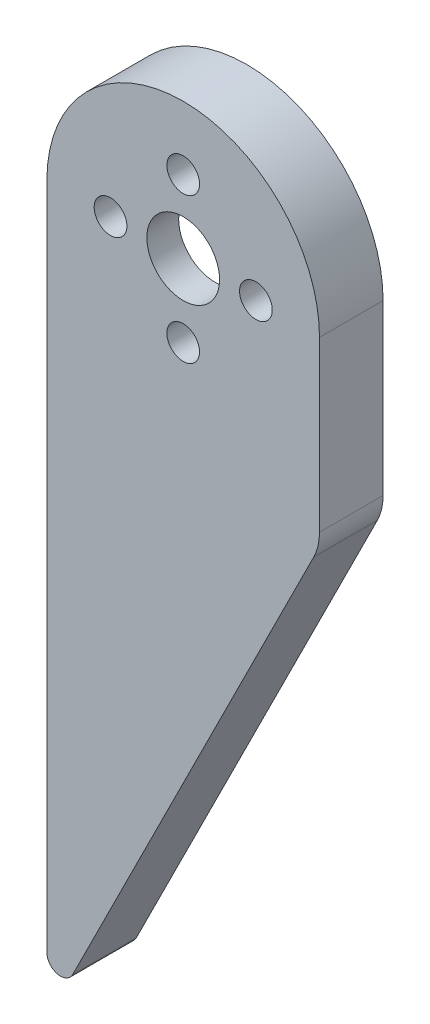
ISO-10303-21;
HEADER;
FILE_DESCRIPTION(('STEP AP214'),'2;1');
FILE_NAME('part.step','',(''),(''),'','','');
FILE_SCHEMA(('AUTOMOTIVE_DESIGN { 1 0 10303 214 1 1 1 1 }'));
ENDSEC;
DATA;
#1=APPLICATION_CONTEXT('core data for automotive mechanical design processes');
#2=APPLICATION_PROTOCOL_DEFINITION('international standard','automotive_design',2000,#1);
#3=PRODUCT_CONTEXT('',#1,'mechanical');
#4=PRODUCT('Part','Part','',(#3));
#5=PRODUCT_RELATED_PRODUCT_CATEGORY('part','',(#4));
#6=PRODUCT_DEFINITION_FORMATION('','',#4);
#7=PRODUCT_DEFINITION_CONTEXT('part definition',#1,'design');
#8=PRODUCT_DEFINITION('design','',#6,#7);
#9=PRODUCT_DEFINITION_SHAPE('','',#8);
#10=(LENGTH_UNIT() NAMED_UNIT(*) SI_UNIT(.MILLI.,.METRE.));
#11=(NAMED_UNIT(*) PLANE_ANGLE_UNIT() SI_UNIT($,.RADIAN.));
#12=(NAMED_UNIT(*) SI_UNIT($,.STERADIAN.) SOLID_ANGLE_UNIT());
#13=UNCERTAINTY_MEASURE_WITH_UNIT(LENGTH_MEASURE(1.E-05),#10,'distance_accuracy_value','');
#14=(GEOMETRIC_REPRESENTATION_CONTEXT(3) GLOBAL_UNCERTAINTY_ASSIGNED_CONTEXT((#13)) GLOBAL_UNIT_ASSIGNED_CONTEXT((#10,
#11,#12)) REPRESENTATION_CONTEXT('',''));
#15=CARTESIAN_POINT('',(0.,0.,0.));
#16=DIRECTION('',(0.,0.,1.));
#17=DIRECTION('',(1.,0.,0.));
#18=AXIS2_PLACEMENT_3D('',#15,#16,#17);
#19=CARTESIAN_POINT('',(0.,8.,7.));
#20=DIRECTION('',(0.,0.,-1.));
#21=DIRECTION('',(-1.,0.,0.));
#22=AXIS2_PLACEMENT_3D('',#19,#20,#21);
#23=CYLINDRICAL_SURFACE('',#22,1.8);
#24=CARTESIAN_POINT('',(0.,8.,7.));
#25=DIRECTION('',(0.,0.,1.));
#26=DIRECTION('',(1.,0.,0.));
#27=AXIS2_PLACEMENT_3D('',#24,#25,#26);
#28=CIRCLE('',#27,1.8);
#29=CARTESIAN_POINT('',(1.8,8.,7.));
#30=VERTEX_POINT('',#29);
#31=EDGE_CURVE('E134',#30,#30,#28,.T.);
#32=ORIENTED_EDGE('',*,*,#31,.T.);
#33=EDGE_LOOP('',(#32));
#34=FACE_BOUND('',#33,.T.);
#35=CARTESIAN_POINT('',(0.,8.,3.5));
#36=DIRECTION('',(0.,0.,-1.));
#37=DIRECTION('',(-1.,0.,0.));
#38=AXIS2_PLACEMENT_3D('',#35,#36,#37);
#39=CIRCLE('',#38,1.8);
#40=CARTESIAN_POINT('',(-1.8,8.,3.5));
#41=VERTEX_POINT('',#40);
#42=EDGE_CURVE('E119',#41,#41,#39,.T.);
#43=ORIENTED_EDGE('',*,*,#42,.T.);
#44=EDGE_LOOP('',(#43));
#45=FACE_BOUND('',#44,.T.);
#46=ADVANCED_FACE('F37',(#34,#45),#23,.F.);
#47=CARTESIAN_POINT('',(8.,0.,7.));
#48=DIRECTION('',(0.,0.,-1.));
#49=DIRECTION('',(-1.,0.,0.));
#50=AXIS2_PLACEMENT_3D('',#47,#48,#49);
#51=CYLINDRICAL_SURFACE('',#50,1.8);
#52=CARTESIAN_POINT('',(8.,0.,7.));
#53=DIRECTION('',(0.,0.,1.));
#54=DIRECTION('',(1.,0.,0.));
#55=AXIS2_PLACEMENT_3D('',#52,#53,#54);
#56=CIRCLE('',#55,1.8);
#57=CARTESIAN_POINT('',(9.8,0.,7.));
#58=VERTEX_POINT('',#57);
#59=EDGE_CURVE('E131',#58,#58,#56,.T.);
#60=ORIENTED_EDGE('',*,*,#59,.T.);
#61=EDGE_LOOP('',(#60));
#62=FACE_BOUND('',#61,.T.);
#63=CARTESIAN_POINT('',(8.,0.,3.5));
#64=DIRECTION('',(0.,0.,-1.));
#65=DIRECTION('',(-1.,0.,0.));
#66=AXIS2_PLACEMENT_3D('',#63,#64,#65);
#67=CIRCLE('',#66,1.8);
#68=CARTESIAN_POINT('',(6.2,0.,3.5));
#69=VERTEX_POINT('',#68);
#70=EDGE_CURVE('E233',#69,#69,#67,.T.);
#71=ORIENTED_EDGE('',*,*,#70,.T.);
#72=EDGE_LOOP('',(#71));
#73=FACE_BOUND('',#72,.T.);
#74=ADVANCED_FACE('F180',(#62,#73),#51,.F.);
#75=CARTESIAN_POINT('',(0.,-8.,7.));
#76=DIRECTION('',(0.,0.,-1.));
#77=DIRECTION('',(-1.,0.,0.));
#78=AXIS2_PLACEMENT_3D('',#75,#76,#77);
#79=CYLINDRICAL_SURFACE('',#78,1.8);
#80=CARTESIAN_POINT('',(0.,-8.,7.));
#81=DIRECTION('',(0.,0.,1.));
#82=DIRECTION('',(1.,0.,0.));
#83=AXIS2_PLACEMENT_3D('',#80,#81,#82);
#84=CIRCLE('',#83,1.8);
#85=CARTESIAN_POINT('',(1.8,-8.,7.));
#86=VERTEX_POINT('',#85);
#87=EDGE_CURVE('E128',#86,#86,#84,.T.);
#88=ORIENTED_EDGE('',*,*,#87,.T.);
#89=EDGE_LOOP('',(#88));
#90=FACE_BOUND('',#89,.T.);
#91=CARTESIAN_POINT('',(0.,-8.,3.5));
#92=DIRECTION('',(0.,0.,-1.));
#93=DIRECTION('',(-1.,0.,0.));
#94=AXIS2_PLACEMENT_3D('',#91,#92,#93);
#95=CIRCLE('',#94,1.8);
#96=CARTESIAN_POINT('',(-1.8,-8.,3.5));
#97=VERTEX_POINT('',#96);
#98=EDGE_CURVE('E222',#97,#97,#95,.T.);
#99=ORIENTED_EDGE('',*,*,#98,.T.);
#100=EDGE_LOOP('',(#99));
#101=FACE_BOUND('',#100,.T.);
#102=ADVANCED_FACE('F186',(#90,#101),#79,.F.);
#103=CARTESIAN_POINT('',(-8.,0.,7.));
#104=DIRECTION('',(0.,0.,-1.));
#105=DIRECTION('',(-1.,0.,0.));
#106=AXIS2_PLACEMENT_3D('',#103,#104,#105);
#107=CYLINDRICAL_SURFACE('',#106,1.8);
#108=CARTESIAN_POINT('',(-8.,0.,7.));
#109=DIRECTION('',(0.,0.,1.));
#110=DIRECTION('',(1.,0.,0.));
#111=AXIS2_PLACEMENT_3D('',#108,#109,#110);
#112=CIRCLE('',#111,1.8);
#113=CARTESIAN_POINT('',(-6.2,0.,7.));
#114=VERTEX_POINT('',#113);
#115=EDGE_CURVE('E125',#114,#114,#112,.T.);
#116=ORIENTED_EDGE('',*,*,#115,.T.);
#117=EDGE_LOOP('',(#116));
#118=FACE_BOUND('',#117,.T.);
#119=CARTESIAN_POINT('',(-8.,0.,3.5));
#120=DIRECTION('',(0.,0.,-1.));
#121=DIRECTION('',(-1.,0.,0.));
#122=AXIS2_PLACEMENT_3D('',#119,#120,#121);
#123=CIRCLE('',#122,1.8);
#124=CARTESIAN_POINT('',(-9.8,0.,3.5));
#125=VERTEX_POINT('',#124);
#126=EDGE_CURVE('E219',#125,#125,#123,.T.);
#127=ORIENTED_EDGE('',*,*,#126,.T.);
#128=EDGE_LOOP('',(#127));
#129=FACE_BOUND('',#128,.T.);
#130=ADVANCED_FACE('F196',(#118,#129),#107,.F.);
#131=CARTESIAN_POINT('',(0.,0.,7.));
#132=DIRECTION('',(0.,0.,-1.));
#133=DIRECTION('',(-1.,0.,0.));
#134=AXIS2_PLACEMENT_3D('',#131,#132,#133);
#135=CYLINDRICAL_SURFACE('',#134,4.);
#136=CARTESIAN_POINT('',(0.,0.,7.));
#137=DIRECTION('',(0.,0.,1.));
#138=DIRECTION('',(1.,0.,0.));
#139=AXIS2_PLACEMENT_3D('',#136,#137,#138);
#140=CIRCLE('',#139,4.);
#141=CARTESIAN_POINT('',(4.,0.,7.));
#142=VERTEX_POINT('',#141);
#143=EDGE_CURVE('E137',#142,#142,#140,.T.);
#144=ORIENTED_EDGE('',*,*,#143,.T.);
#145=EDGE_LOOP('',(#144));
#146=FACE_BOUND('',#145,.T.);
#147=CARTESIAN_POINT('',(0.,0.,3.5));
#148=DIRECTION('',(0.,0.,-1.));
#149=DIRECTION('',(-1.,0.,0.));
#150=AXIS2_PLACEMENT_3D('',#147,#148,#149);
#151=CIRCLE('',#150,4.);
#152=CARTESIAN_POINT('',(-4.,0.,3.5));
#153=VERTEX_POINT('',#152);
#154=EDGE_CURVE('E41',#153,#153,#151,.T.);
#155=ORIENTED_EDGE('',*,*,#154,.T.);
#156=EDGE_LOOP('',(#155));
#157=FACE_BOUND('',#156,.T.);
#158=ADVANCED_FACE('F191',(#146,#157),#135,.F.);
#159=CARTESIAN_POINT('',(15.,0.,7.));
#160=DIRECTION('',(1.,0.,0.));
#161=DIRECTION('',(0.,1.,0.));
#162=AXIS2_PLACEMENT_3D('',#159,#160,#161);
#163=PLANE('',#162);
#164=DIRECTION('',(0.,-1.,0.));
#165=VECTOR('',#164,1.);
#166=CARTESIAN_POINT('',(15.,0.,7.));
#167=LINE('',#166,#165);
#168=CARTESIAN_POINT('',(15.,0.,7.));
#169=VERTEX_POINT('',#168);
#170=CARTESIAN_POINT('',(15.,-18.5835921350013,7.));
#171=VERTEX_POINT('',#170);
#172=EDGE_CURVE('E94',#169,#171,#167,.T.);
#173=ORIENTED_EDGE('',*,*,#172,.T.);
#174=DIRECTION('',(0.,0.,-1.));
#175=VECTOR('',#174,1.);
#176=CARTESIAN_POINT('',(15.,-18.5835921350013,7.));
#177=LINE('',#176,#175);
#178=CARTESIAN_POINT('',(15.,-18.5835921350013,0.));
#179=VERTEX_POINT('',#178);
#180=EDGE_CURVE('E155',#171,#179,#177,.T.);
#181=ORIENTED_EDGE('',*,*,#180,.T.);
#182=DIRECTION('',(0.,-1.,0.));
#183=VECTOR('',#182,1.);
#184=CARTESIAN_POINT('',(15.,0.,0.));
#185=LINE('',#184,#183);
#186=CARTESIAN_POINT('',(15.,0.,0.));
#187=VERTEX_POINT('',#186);
#188=EDGE_CURVE('E96',#187,#179,#185,.T.);
#189=ORIENTED_EDGE('',*,*,#188,.F.);
#190=DIRECTION('',(0.,0.,-1.));
#191=VECTOR('',#190,1.);
#192=CARTESIAN_POINT('',(15.,0.,7.));
#193=LINE('',#192,#191);
#194=EDGE_CURVE('E89',#169,#187,#193,.T.);
#195=ORIENTED_EDGE('',*,*,#194,.F.);
#196=EDGE_LOOP('',(#173,#181,#189,#195));
#197=FACE_BOUND('',#196,.T.);
#198=ADVANCED_FACE('F91',(#197),#163,.T.);
#199=CARTESIAN_POINT('',(0.,0.,7.));
#200=DIRECTION('',(0.,0.,-1.));
#201=DIRECTION('',(-1.,0.,0.));
#202=AXIS2_PLACEMENT_3D('',#199,#200,#201);
#203=CYLINDRICAL_SURFACE('',#202,15.);
#204=CARTESIAN_POINT('',(0.,0.,0.));
#205=DIRECTION('',(0.,0.,1.));
#206=DIRECTION('',(1.,0.,0.));
#207=AXIS2_PLACEMENT_3D('',#204,#205,#206);
#208=CIRCLE('',#207,15.);
#209=CARTESIAN_POINT('',(-15.,0.,0.));
#210=VERTEX_POINT('',#209);
#211=EDGE_CURVE('E141',#187,#210,#208,.T.);
#212=ORIENTED_EDGE('',*,*,#211,.T.);
#213=DIRECTION('',(0.,0.,-1.));
#214=VECTOR('',#213,1.);
#215=CARTESIAN_POINT('',(-15.,0.,7.));
#216=LINE('',#215,#214);
#217=CARTESIAN_POINT('',(-15.,0.,7.));
#218=VERTEX_POINT('',#217);
#219=EDGE_CURVE('E100',#218,#210,#216,.T.);
#220=ORIENTED_EDGE('',*,*,#219,.F.);
#221=CARTESIAN_POINT('',(0.,0.,7.));
#222=DIRECTION('',(0.,0.,1.));
#223=DIRECTION('',(1.,0.,0.));
#224=AXIS2_PLACEMENT_3D('',#221,#222,#223);
#225=CIRCLE('',#224,15.);
#226=EDGE_CURVE('E103',#169,#218,#225,.T.);
#227=ORIENTED_EDGE('',*,*,#226,.F.);
#228=ORIENTED_EDGE('',*,*,#194,.T.);
#229=EDGE_LOOP('',(#212,#220,#227,#228));
#230=FACE_BOUND('',#229,.T.);
#231=ADVANCED_FACE('F104',(#230),#203,.T.);
#232=CARTESIAN_POINT('',(-15.,0.,7.));
#233=DIRECTION('',(1.,0.,0.));
#234=DIRECTION('',(0.,1.,0.));
#235=AXIS2_PLACEMENT_3D('',#232,#233,#234);
#236=PLANE('',#235);
#237=DIRECTION('',(0.,-1.,0.));
#238=VECTOR('',#237,1.);
#239=CARTESIAN_POINT('',(-15.,0.,0.));
#240=LINE('',#239,#238);
#241=CARTESIAN_POINT('',(-15.,-73.6458980337503,0.));
#242=VERTEX_POINT('',#241);
#243=EDGE_CURVE('E116',#210,#242,#240,.T.);
#244=ORIENTED_EDGE('',*,*,#243,.T.);
#245=DIRECTION('',(0.,0.,-1.));
#246=VECTOR('',#245,1.);
#247=CARTESIAN_POINT('',(-15.,-73.6458980337503,7.));
#248=LINE('',#247,#246);
#249=CARTESIAN_POINT('',(-15.,-73.6458980337503,7.));
#250=VERTEX_POINT('',#249);
#251=EDGE_CURVE('E150',#242,#250,#248,.F.);
#252=ORIENTED_EDGE('',*,*,#251,.T.);
#253=DIRECTION('',(0.,-1.,0.));
#254=VECTOR('',#253,1.);
#255=CARTESIAN_POINT('',(-15.,0.,7.));
#256=LINE('',#255,#254);
#257=EDGE_CURVE('E109',#218,#250,#256,.T.);
#258=ORIENTED_EDGE('',*,*,#257,.F.);
#259=ORIENTED_EDGE('',*,*,#219,.T.);
#260=EDGE_LOOP('',(#244,#252,#258,#259));
#261=FACE_BOUND('',#260,.T.);
#262=ADVANCED_FACE('F162',(#261),#236,.F.);
#263=CARTESIAN_POINT('',(20.,-9.99999999999999,7.));
#264=DIRECTION('',(0.894427190999916,-0.447213595499958,0.));
#265=DIRECTION('',(0.447213595499958,0.894427190999916,0.));
#266=AXIS2_PLACEMENT_3D('',#263,#264,#265);
#267=PLANE('',#266);
#268=DIRECTION('',(-0.447213595499958,-0.894427190999916,0.));
#269=VECTOR('',#268,1.);
#270=CARTESIAN_POINT('',(20.,-9.99999999999999,0.));
#271=LINE('',#270,#269);
#272=CARTESIAN_POINT('',(14.3665631459995,-21.266873708001,0.));
#273=VERTEX_POINT('',#272);
#274=CARTESIAN_POINT('',(-12.1583592135001,-74.3167184270003,0.));
#275=VERTEX_POINT('',#274);
#276=EDGE_CURVE('E114',#273,#275,#271,.T.);
#277=ORIENTED_EDGE('',*,*,#276,.F.);
#278=DIRECTION('',(0.,0.,-1.));
#279=VECTOR('',#278,1.);
#280=CARTESIAN_POINT('',(14.3665631459995,-21.266873708001,7.));
#281=LINE('',#280,#279);
#282=CARTESIAN_POINT('',(14.3665631459995,-21.266873708001,7.));
#283=VERTEX_POINT('',#282);
#284=EDGE_CURVE('E46',#273,#283,#281,.F.);
#285=ORIENTED_EDGE('',*,*,#284,.T.);
#286=DIRECTION('',(-0.447213595499958,-0.894427190999916,0.));
#287=VECTOR('',#286,1.);
#288=CARTESIAN_POINT('',(20.,-9.99999999999999,7.));
#289=LINE('',#288,#287);
#290=CARTESIAN_POINT('',(-12.1583592135001,-74.3167184270003,7.));
#291=VERTEX_POINT('',#290);
#292=EDGE_CURVE('E123',#283,#291,#289,.T.);
#293=ORIENTED_EDGE('',*,*,#292,.T.);
#294=DIRECTION('',(0.,0.,-1.));
#295=VECTOR('',#294,1.);
#296=CARTESIAN_POINT('',(-12.1583592135001,-74.3167184270003,0.));
#297=LINE('',#296,#295);
#298=EDGE_CURVE('E99',#291,#275,#297,.T.);
#299=ORIENTED_EDGE('',*,*,#298,.T.);
#300=EDGE_LOOP('',(#277,#285,#293,#299));
#301=FACE_BOUND('',#300,.T.);
#302=ADVANCED_FACE('F169',(#301),#267,.T.);
#303=CARTESIAN_POINT('',(0.,0.,7.));
#304=DIRECTION('',(0.,0.,1.));
#305=DIRECTION('',(1.,0.,0.));
#306=AXIS2_PLACEMENT_3D('',#303,#304,#305);
#307=PLANE('',#306);
#308=ORIENTED_EDGE('',*,*,#292,.F.);
#309=CARTESIAN_POINT('',(9.,-18.5835921350013,7.));
#310=DIRECTION('',(0.,0.,1.));
#311=DIRECTION('',(1.,0.,0.));
#312=AXIS2_PLACEMENT_3D('',#309,#310,#311);
#313=CIRCLE('',#312,6.);
#314=EDGE_CURVE('E11',#283,#171,#313,.T.);
#315=ORIENTED_EDGE('',*,*,#314,.T.);
#316=ORIENTED_EDGE('',*,*,#172,.F.);
#317=ORIENTED_EDGE('',*,*,#226,.T.);
#318=ORIENTED_EDGE('',*,*,#257,.T.);
#319=CARTESIAN_POINT('',(-13.5,-73.6458980337503,7.));
#320=DIRECTION('',(0.,0.,1.));
#321=DIRECTION('',(1.,0.,0.));
#322=AXIS2_PLACEMENT_3D('',#319,#320,#321);
#323=CIRCLE('',#322,1.5);
#324=EDGE_CURVE('E152',#250,#291,#323,.T.);
#325=ORIENTED_EDGE('',*,*,#324,.T.);
#326=EDGE_LOOP('',(#308,#315,#316,#317,#318,#325));
#327=FACE_BOUND('',#326,.T.);
#328=ORIENTED_EDGE('',*,*,#115,.F.);
#329=EDGE_LOOP('',(#328));
#330=FACE_BOUND('',#329,.T.);
#331=ORIENTED_EDGE('',*,*,#87,.F.);
#332=EDGE_LOOP('',(#331));
#333=FACE_BOUND('',#332,.T.);
#334=ORIENTED_EDGE('',*,*,#59,.F.);
#335=EDGE_LOOP('',(#334));
#336=FACE_BOUND('',#335,.T.);
#337=ORIENTED_EDGE('',*,*,#31,.F.);
#338=EDGE_LOOP('',(#337));
#339=FACE_BOUND('',#338,.T.);
#340=ORIENTED_EDGE('',*,*,#143,.F.);
#341=EDGE_LOOP('',(#340));
#342=FACE_BOUND('',#341,.T.);
#343=ADVANCED_FACE('F111',(#327,#330,#333,#336,#339,#342),#307,.T.);
#344=CARTESIAN_POINT('',(0.,0.,0.));
#345=DIRECTION('',(0.,0.,1.));
#346=DIRECTION('',(1.,0.,0.));
#347=AXIS2_PLACEMENT_3D('',#344,#345,#346);
#348=PLANE('',#347);
#349=CARTESIAN_POINT('',(0.,0.,0.));
#350=DIRECTION('',(0.,0.,-1.));
#351=DIRECTION('',(-1.,0.,0.));
#352=AXIS2_PLACEMENT_3D('',#349,#350,#351);
#353=CIRCLE('',#352,12.);
#354=CARTESIAN_POINT('',(-12.,0.,0.));
#355=VERTEX_POINT('',#354);
#356=EDGE_CURVE('E225',#355,#355,#353,.T.);
#357=ORIENTED_EDGE('',*,*,#356,.F.);
#358=EDGE_LOOP('',(#357));
#359=FACE_BOUND('',#358,.T.);
#360=ORIENTED_EDGE('',*,*,#188,.T.);
#361=CARTESIAN_POINT('',(9.,-18.5835921350013,0.));
#362=DIRECTION('',(0.,0.,1.));
#363=DIRECTION('',(1.,0.,0.));
#364=AXIS2_PLACEMENT_3D('',#361,#362,#363);
#365=CIRCLE('',#364,6.);
#366=EDGE_CURVE('E60',#179,#273,#365,.F.);
#367=ORIENTED_EDGE('',*,*,#366,.T.);
#368=ORIENTED_EDGE('',*,*,#276,.T.);
#369=CARTESIAN_POINT('',(-13.5,-73.6458980337503,0.));
#370=DIRECTION('',(0.,0.,1.));
#371=DIRECTION('',(1.,0.,0.));
#372=AXIS2_PLACEMENT_3D('',#369,#370,#371);
#373=CIRCLE('',#372,1.5);
#374=EDGE_CURVE('E148',#275,#242,#373,.F.);
#375=ORIENTED_EDGE('',*,*,#374,.T.);
#376=ORIENTED_EDGE('',*,*,#243,.F.);
#377=ORIENTED_EDGE('',*,*,#211,.F.);
#378=EDGE_LOOP('',(#360,#367,#368,#375,#376,#377));
#379=FACE_BOUND('',#378,.T.);
#380=ADVANCED_FACE('F159',(#359,#379),#348,.F.);
#381=CARTESIAN_POINT('',(-13.5,-73.6458980337503,7.));
#382=DIRECTION('',(0.,0.,1.));
#383=DIRECTION('',(1.,0.,0.));
#384=AXIS2_PLACEMENT_3D('',#381,#382,#383);
#385=CYLINDRICAL_SURFACE('',#384,1.5);
#386=ORIENTED_EDGE('',*,*,#324,.F.);
#387=ORIENTED_EDGE('',*,*,#251,.F.);
#388=ORIENTED_EDGE('',*,*,#374,.F.);
#389=ORIENTED_EDGE('',*,*,#298,.F.);
#390=EDGE_LOOP('',(#386,#387,#388,#389));
#391=FACE_BOUND('',#390,.T.);
#392=ADVANCED_FACE('F167',(#391),#385,.T.);
#393=CARTESIAN_POINT('',(9.,-18.5835921350013,7.));
#394=DIRECTION('',(0.,0.,-1.));
#395=DIRECTION('',(-1.,0.,0.));
#396=AXIS2_PLACEMENT_3D('',#393,#394,#395);
#397=CYLINDRICAL_SURFACE('',#396,6.);
#398=ORIENTED_EDGE('',*,*,#314,.F.);
#399=ORIENTED_EDGE('',*,*,#284,.F.);
#400=ORIENTED_EDGE('',*,*,#366,.F.);
#401=ORIENTED_EDGE('',*,*,#180,.F.);
#402=EDGE_LOOP('',(#398,#399,#400,#401));
#403=FACE_BOUND('',#402,.T.);
#404=ADVANCED_FACE('F39',(#403),#397,.T.);
#405=CARTESIAN_POINT('',(0.,0.,3.5));
#406=DIRECTION('',(0.,0.,-1.));
#407=DIRECTION('',(-1.,0.,0.));
#408=AXIS2_PLACEMENT_3D('',#405,#406,#407);
#409=CYLINDRICAL_SURFACE('',#408,12.);
#410=CARTESIAN_POINT('',(0.,0.,3.5));
#411=DIRECTION('',(0.,0.,-1.));
#412=DIRECTION('',(-1.,0.,0.));
#413=AXIS2_PLACEMENT_3D('',#410,#411,#412);
#414=CIRCLE('',#413,12.);
#415=CARTESIAN_POINT('',(-12.,0.,3.5));
#416=VERTEX_POINT('',#415);
#417=EDGE_CURVE('E220',#416,#416,#414,.T.);
#418=ORIENTED_EDGE('',*,*,#417,.F.);
#419=EDGE_LOOP('',(#418));
#420=FACE_BOUND('',#419,.T.);
#421=ORIENTED_EDGE('',*,*,#356,.T.);
#422=EDGE_LOOP('',(#421));
#423=FACE_BOUND('',#422,.T.);
#424=ADVANCED_FACE('F171',(#420,#423),#409,.F.);
#425=CARTESIAN_POINT('',(0.,0.,3.5));
#426=DIRECTION('',(0.,0.,-1.));
#427=DIRECTION('',(-1.,0.,0.));
#428=AXIS2_PLACEMENT_3D('',#425,#426,#427);
#429=PLANE('',#428);
#430=ORIENTED_EDGE('',*,*,#42,.F.);
#431=EDGE_LOOP('',(#430));
#432=FACE_BOUND('',#431,.T.);
#433=ORIENTED_EDGE('',*,*,#70,.F.);
#434=EDGE_LOOP('',(#433));
#435=FACE_BOUND('',#434,.T.);
#436=ORIENTED_EDGE('',*,*,#98,.F.);
#437=EDGE_LOOP('',(#436));
#438=FACE_BOUND('',#437,.T.);
#439=ORIENTED_EDGE('',*,*,#126,.F.);
#440=EDGE_LOOP('',(#439));
#441=FACE_BOUND('',#440,.T.);
#442=ORIENTED_EDGE('',*,*,#154,.F.);
#443=EDGE_LOOP('',(#442));
#444=FACE_BOUND('',#443,.T.);
#445=ORIENTED_EDGE('',*,*,#417,.T.);
#446=EDGE_LOOP('',(#445));
#447=FACE_BOUND('',#446,.T.);
#448=ADVANCED_FACE('F176',(#432,#435,#438,#441,#444,#447),#429,.T.);
#449=CLOSED_SHELL('',(#46,#74,#102,#130,#158,#198,#231,#262,#302,#343,#380,#392,#404,#424,#448));
#450=MANIFOLD_SOLID_BREP('B2',#449);
#451=ADVANCED_BREP_SHAPE_REPRESENTATION('',(#18,#450),#14);
#452=SHAPE_DEFINITION_REPRESENTATION(#9,#451);
ENDSEC;
END-ISO-10303-21;
